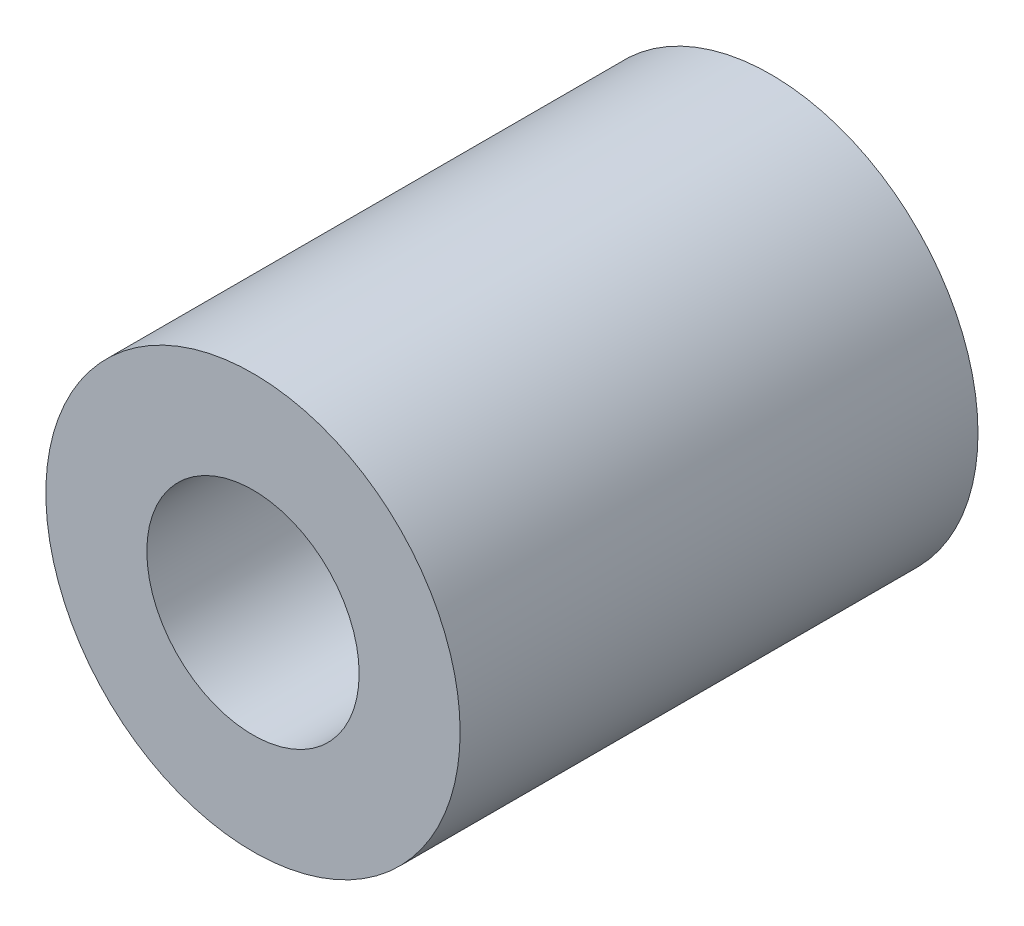
ISO-10303-21;
HEADER;
FILE_DESCRIPTION(('STEP AP214'),'2;1');
FILE_NAME('part.step','',(''),(''),'','','');
FILE_SCHEMA(('AUTOMOTIVE_DESIGN { 1 0 10303 214 1 1 1 1 }'));
ENDSEC;
DATA;
#1=APPLICATION_CONTEXT('core data for automotive mechanical design processes');
#2=APPLICATION_PROTOCOL_DEFINITION('international standard','automotive_design',2000,#1);
#3=PRODUCT_CONTEXT('',#1,'mechanical');
#4=PRODUCT('Part','Part','',(#3));
#5=PRODUCT_RELATED_PRODUCT_CATEGORY('part','',(#4));
#6=PRODUCT_DEFINITION_FORMATION('','',#4);
#7=PRODUCT_DEFINITION_CONTEXT('part definition',#1,'design');
#8=PRODUCT_DEFINITION('design','',#6,#7);
#9=PRODUCT_DEFINITION_SHAPE('','',#8);
#10=(LENGTH_UNIT() NAMED_UNIT(*) SI_UNIT(.MILLI.,.METRE.));
#11=(NAMED_UNIT(*) PLANE_ANGLE_UNIT() SI_UNIT($,.RADIAN.));
#12=(NAMED_UNIT(*) SI_UNIT($,.STERADIAN.) SOLID_ANGLE_UNIT());
#13=UNCERTAINTY_MEASURE_WITH_UNIT(LENGTH_MEASURE(1.E-05),#10,'distance_accuracy_value','');
#14=(GEOMETRIC_REPRESENTATION_CONTEXT(3) GLOBAL_UNCERTAINTY_ASSIGNED_CONTEXT((#13)) GLOBAL_UNIT_ASSIGNED_CONTEXT((#10,
#11,#12)) REPRESENTATION_CONTEXT('',''));
#15=CARTESIAN_POINT('',(0.,0.,0.));
#16=DIRECTION('',(0.,0.,1.));
#17=DIRECTION('',(1.,0.,0.));
#18=AXIS2_PLACEMENT_3D('',#15,#16,#17);
#19=CARTESIAN_POINT('',(170.3,97.1843117146728,10.));
#20=DIRECTION('',(0.,0.,-1.));
#21=DIRECTION('',(-1.,0.,0.));
#22=AXIS2_PLACEMENT_3D('',#19,#20,#21);
#23=CYLINDRICAL_SURFACE('',#22,4.00000000000002);
#24=CARTESIAN_POINT('',(170.3,97.1843117146728,10.));
#25=DIRECTION('',(0.,0.,1.));
#26=DIRECTION('',(1.,0.,0.));
#27=AXIS2_PLACEMENT_3D('',#24,#25,#26);
#28=CIRCLE('',#27,4.00000000000002);
#29=CARTESIAN_POINT('',(174.3,97.1843117146728,10.));
#30=VERTEX_POINT('',#29);
#31=EDGE_CURVE('E10',#30,#30,#28,.T.);
#32=ORIENTED_EDGE('',*,*,#31,.F.);
#33=EDGE_LOOP('',(#32));
#34=FACE_BOUND('',#33,.T.);
#35=CARTESIAN_POINT('',(170.3,97.1843117146728,0.));
#36=DIRECTION('',(0.,0.,1.));
#37=DIRECTION('',(1.,0.,0.));
#38=AXIS2_PLACEMENT_3D('',#35,#36,#37);
#39=CIRCLE('',#38,4.00000000000002);
#40=CARTESIAN_POINT('',(174.3,97.1843117146728,0.));
#41=VERTEX_POINT('',#40);
#42=EDGE_CURVE('E36',#41,#41,#39,.T.);
#43=ORIENTED_EDGE('',*,*,#42,.T.);
#44=EDGE_LOOP('',(#43));
#45=FACE_BOUND('',#44,.T.);
#46=ADVANCED_FACE('F33',(#34,#45),#23,.T.);
#47=CARTESIAN_POINT('',(170.3,97.1843117146728,10.));
#48=DIRECTION('',(0.,0.,1.));
#49=DIRECTION('',(1.,0.,0.));
#50=AXIS2_PLACEMENT_3D('',#47,#48,#49);
#51=PLANE('',#50);
#52=CARTESIAN_POINT('',(170.3,97.1843117146728,10.));
#53=DIRECTION('',(0.,0.,1.));
#54=DIRECTION('',(1.,0.,0.));
#55=AXIS2_PLACEMENT_3D('',#52,#53,#54);
#56=CIRCLE('',#55,2.04999999999999);
#57=CARTESIAN_POINT('',(172.35,97.1843117146728,10.));
#58=VERTEX_POINT('',#57);
#59=EDGE_CURVE('E45',#58,#58,#56,.T.);
#60=ORIENTED_EDGE('',*,*,#59,.F.);
#61=EDGE_LOOP('',(#60));
#62=FACE_BOUND('',#61,.T.);
#63=ORIENTED_EDGE('',*,*,#31,.T.);
#64=EDGE_LOOP('',(#63));
#65=FACE_BOUND('',#64,.T.);
#66=ADVANCED_FACE('F60',(#62,#65),#51,.T.);
#67=CARTESIAN_POINT('',(170.3,97.1843117146728,0.));
#68=DIRECTION('',(0.,0.,1.));
#69=DIRECTION('',(1.,0.,0.));
#70=AXIS2_PLACEMENT_3D('',#67,#68,#69);
#71=PLANE('',#70);
#72=CARTESIAN_POINT('',(170.3,97.1843117146728,0.));
#73=DIRECTION('',(0.,0.,1.));
#74=DIRECTION('',(1.,0.,0.));
#75=AXIS2_PLACEMENT_3D('',#72,#73,#74);
#76=CIRCLE('',#75,2.04999999999999);
#77=CARTESIAN_POINT('',(172.35,97.1843117146728,0.));
#78=VERTEX_POINT('',#77);
#79=EDGE_CURVE('E43',#78,#78,#76,.T.);
#80=ORIENTED_EDGE('',*,*,#79,.T.);
#81=EDGE_LOOP('',(#80));
#82=FACE_BOUND('',#81,.T.);
#83=ORIENTED_EDGE('',*,*,#42,.F.);
#84=EDGE_LOOP('',(#83));
#85=FACE_BOUND('',#84,.T.);
#86=ADVANCED_FACE('F51',(#82,#85),#71,.F.);
#87=CARTESIAN_POINT('',(170.3,97.1843117146728,0.));
#88=DIRECTION('',(0.,0.,1.));
#89=DIRECTION('',(1.,0.,0.));
#90=AXIS2_PLACEMENT_3D('',#87,#88,#89);
#91=CYLINDRICAL_SURFACE('',#90,2.04999999999999);
#92=ORIENTED_EDGE('',*,*,#79,.F.);
#93=EDGE_LOOP('',(#92));
#94=FACE_BOUND('',#93,.T.);
#95=ORIENTED_EDGE('',*,*,#59,.T.);
#96=EDGE_LOOP('',(#95));
#97=FACE_BOUND('',#96,.T.);
#98=ADVANCED_FACE('F54',(#94,#97),#91,.F.);
#99=CLOSED_SHELL('',(#46,#66,#86,#98));
#100=MANIFOLD_SOLID_BREP('B2',#99);
#101=ADVANCED_BREP_SHAPE_REPRESENTATION('',(#18,#100),#14);
#102=SHAPE_DEFINITION_REPRESENTATION(#9,#101);
ENDSEC;
END-ISO-10303-21;
